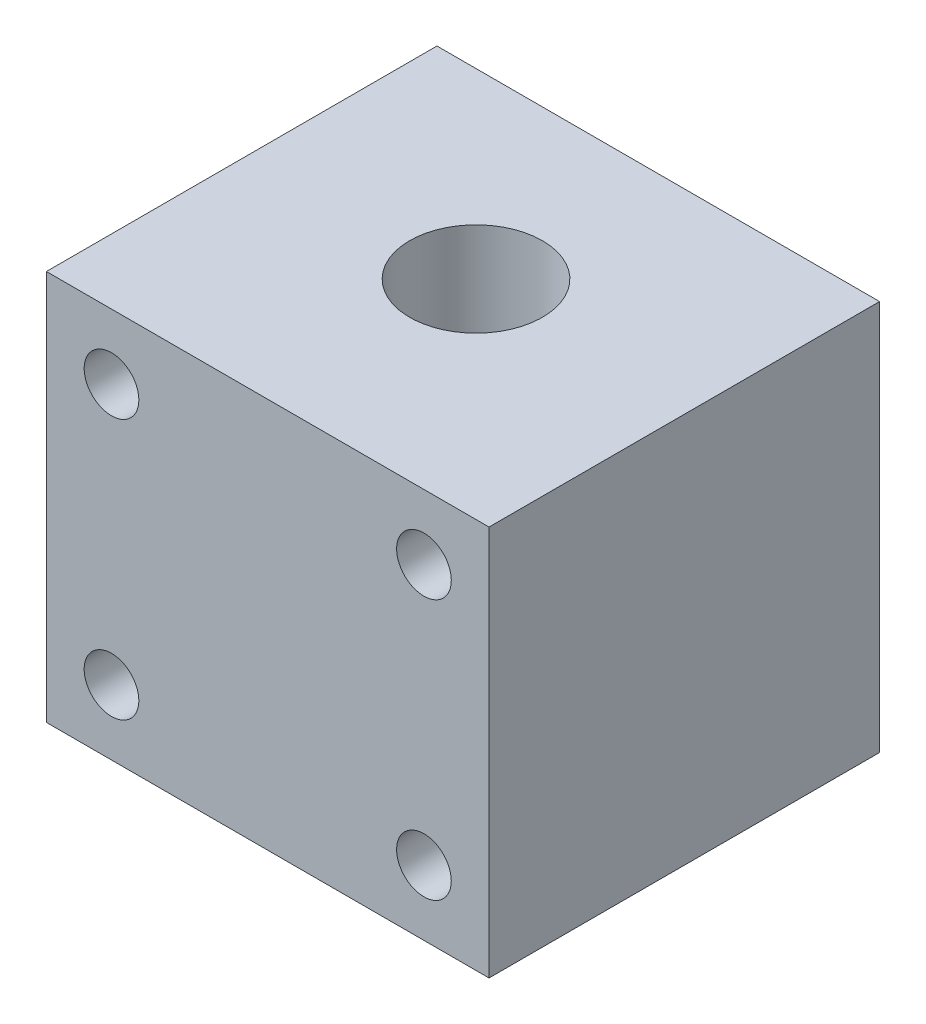
ISO-10303-21;
HEADER;
FILE_DESCRIPTION(('STEP AP214'),'2;1');
FILE_NAME('part.step','',(''),(''),'','','');
FILE_SCHEMA(('AUTOMOTIVE_DESIGN { 1 0 10303 214 1 1 1 1 }'));
ENDSEC;
DATA;
#1=APPLICATION_CONTEXT('core data for automotive mechanical design processes');
#2=APPLICATION_PROTOCOL_DEFINITION('international standard','automotive_design',2000,#1);
#3=PRODUCT_CONTEXT('',#1,'mechanical');
#4=PRODUCT('Part','Part','',(#3));
#5=PRODUCT_RELATED_PRODUCT_CATEGORY('part','',(#4));
#6=PRODUCT_DEFINITION_FORMATION('','',#4);
#7=PRODUCT_DEFINITION_CONTEXT('part definition',#1,'design');
#8=PRODUCT_DEFINITION('design','',#6,#7);
#9=PRODUCT_DEFINITION_SHAPE('','',#8);
#10=(LENGTH_UNIT() NAMED_UNIT(*) SI_UNIT(.MILLI.,.METRE.));
#11=(NAMED_UNIT(*) PLANE_ANGLE_UNIT() SI_UNIT($,.RADIAN.));
#12=(NAMED_UNIT(*) SI_UNIT($,.STERADIAN.) SOLID_ANGLE_UNIT());
#13=UNCERTAINTY_MEASURE_WITH_UNIT(LENGTH_MEASURE(1.E-05),#10,'distance_accuracy_value','');
#14=(GEOMETRIC_REPRESENTATION_CONTEXT(3) GLOBAL_UNCERTAINTY_ASSIGNED_CONTEXT((#13)) GLOBAL_UNIT_ASSIGNED_CONTEXT((#10,
#11,#12)) REPRESENTATION_CONTEXT('',''));
#15=CARTESIAN_POINT('',(0.,0.,0.));
#16=DIRECTION('',(0.,0.,1.));
#17=DIRECTION('',(1.,0.,0.));
#18=AXIS2_PLACEMENT_3D('',#15,#16,#17);
#19=CARTESIAN_POINT('',(17.,30.,-15.));
#20=DIRECTION('',(-1.,0.,0.));
#21=DIRECTION('',(0.,0.,1.));
#22=AXIS2_PLACEMENT_3D('',#19,#20,#21);
#23=PLANE('',#22);
#24=DIRECTION('',(0.,0.,-1.));
#25=VECTOR('',#24,1.);
#26=CARTESIAN_POINT('',(17.,0.,-15.));
#27=LINE('',#26,#25);
#28=CARTESIAN_POINT('',(17.,0.,15.));
#29=VERTEX_POINT('',#28);
#30=CARTESIAN_POINT('',(17.,0.,-15.));
#31=VERTEX_POINT('',#30);
#32=EDGE_CURVE('E106',#29,#31,#27,.T.);
#33=ORIENTED_EDGE('',*,*,#32,.T.);
#34=DIRECTION('',(0.,-1.,0.));
#35=VECTOR('',#34,1.);
#36=CARTESIAN_POINT('',(17.,30.,-15.));
#37=LINE('',#36,#35);
#38=CARTESIAN_POINT('',(17.,30.,-15.));
#39=VERTEX_POINT('',#38);
#40=EDGE_CURVE('E11',#39,#31,#37,.T.);
#41=ORIENTED_EDGE('',*,*,#40,.F.);
#42=DIRECTION('',(0.,0.,-1.));
#43=VECTOR('',#42,1.);
#44=CARTESIAN_POINT('',(17.,30.,-15.));
#45=LINE('',#44,#43);
#46=CARTESIAN_POINT('',(17.,30.,15.));
#47=VERTEX_POINT('',#46);
#48=EDGE_CURVE('E90',#47,#39,#45,.T.);
#49=ORIENTED_EDGE('',*,*,#48,.F.);
#50=DIRECTION('',(0.,-1.,0.));
#51=VECTOR('',#50,1.);
#52=CARTESIAN_POINT('',(17.,30.,15.));
#53=LINE('',#52,#51);
#54=EDGE_CURVE('E102',#47,#29,#53,.T.);
#55=ORIENTED_EDGE('',*,*,#54,.T.);
#56=EDGE_LOOP('',(#33,#41,#49,#55));
#57=FACE_BOUND('',#56,.T.);
#58=ADVANCED_FACE('F38',(#57),#23,.F.);
#59=CARTESIAN_POINT('',(-17.,30.,-15.));
#60=DIRECTION('',(0.,0.,1.));
#61=DIRECTION('',(1.,0.,0.));
#62=AXIS2_PLACEMENT_3D('',#59,#60,#61);
#63=PLANE('',#62);
#64=DIRECTION('',(-1.,0.,0.));
#65=VECTOR('',#64,1.);
#66=CARTESIAN_POINT('',(-17.,0.,-15.));
#67=LINE('',#66,#65);
#68=CARTESIAN_POINT('',(-17.,0.,-15.));
#69=VERTEX_POINT('',#68);
#70=EDGE_CURVE('E95',#31,#69,#67,.T.);
#71=ORIENTED_EDGE('',*,*,#70,.T.);
#72=DIRECTION('',(0.,-1.,0.));
#73=VECTOR('',#72,1.);
#74=CARTESIAN_POINT('',(-17.,30.,-15.));
#75=LINE('',#74,#73);
#76=CARTESIAN_POINT('',(-17.,30.,-15.));
#77=VERTEX_POINT('',#76);
#78=EDGE_CURVE('E47',#77,#69,#75,.T.);
#79=ORIENTED_EDGE('',*,*,#78,.F.);
#80=DIRECTION('',(-1.,0.,0.));
#81=VECTOR('',#80,1.);
#82=CARTESIAN_POINT('',(-17.,30.,-15.));
#83=LINE('',#82,#81);
#84=EDGE_CURVE('E85',#39,#77,#83,.T.);
#85=ORIENTED_EDGE('',*,*,#84,.F.);
#86=ORIENTED_EDGE('',*,*,#40,.T.);
#87=EDGE_LOOP('',(#71,#79,#85,#86));
#88=FACE_BOUND('',#87,.T.);
#89=ADVANCED_FACE('F94',(#88),#63,.F.);
#90=CARTESIAN_POINT('',(-17.,30.,-15.));
#91=DIRECTION('',(1.,0.,0.));
#92=DIRECTION('',(0.,0.,-1.));
#93=AXIS2_PLACEMENT_3D('',#90,#91,#92);
#94=PLANE('',#93);
#95=DIRECTION('',(0.,0.,1.));
#96=VECTOR('',#95,1.);
#97=CARTESIAN_POINT('',(-17.,0.,-15.));
#98=LINE('',#97,#96);
#99=CARTESIAN_POINT('',(-17.,0.,15.));
#100=VERTEX_POINT('',#99);
#101=EDGE_CURVE('E72',#69,#100,#98,.T.);
#102=ORIENTED_EDGE('',*,*,#101,.T.);
#103=DIRECTION('',(0.,-1.,0.));
#104=VECTOR('',#103,1.);
#105=CARTESIAN_POINT('',(-17.,30.,15.));
#106=LINE('',#105,#104);
#107=CARTESIAN_POINT('',(-17.,30.,15.));
#108=VERTEX_POINT('',#107);
#109=EDGE_CURVE('E97',#108,#100,#106,.T.);
#110=ORIENTED_EDGE('',*,*,#109,.F.);
#111=DIRECTION('',(0.,0.,1.));
#112=VECTOR('',#111,1.);
#113=CARTESIAN_POINT('',(-17.,30.,-15.));
#114=LINE('',#113,#112);
#115=EDGE_CURVE('E88',#77,#108,#114,.T.);
#116=ORIENTED_EDGE('',*,*,#115,.F.);
#117=ORIENTED_EDGE('',*,*,#78,.T.);
#118=EDGE_LOOP('',(#102,#110,#116,#117));
#119=FACE_BOUND('',#118,.T.);
#120=ADVANCED_FACE('F98',(#119),#94,.F.);
#121=CARTESIAN_POINT('',(-17.,30.,15.));
#122=DIRECTION('',(0.,0.,-1.));
#123=DIRECTION('',(-1.,0.,0.));
#124=AXIS2_PLACEMENT_3D('',#121,#122,#123);
#125=PLANE('',#124);
#126=CARTESIAN_POINT('',(-12.,25.,15.));
#127=DIRECTION('',(0.,0.,1.));
#128=DIRECTION('',(1.,0.,0.));
#129=AXIS2_PLACEMENT_3D('',#126,#127,#128);
#130=CIRCLE('',#129,2.1);
#131=CARTESIAN_POINT('',(-9.9,25.,15.));
#132=VERTEX_POINT('',#131);
#133=EDGE_CURVE('E175',#132,#132,#130,.T.);
#134=ORIENTED_EDGE('',*,*,#133,.F.);
#135=EDGE_LOOP('',(#134));
#136=FACE_BOUND('',#135,.T.);
#137=CARTESIAN_POINT('',(12.,25.,15.));
#138=DIRECTION('',(0.,0.,1.));
#139=DIRECTION('',(1.,0.,0.));
#140=AXIS2_PLACEMENT_3D('',#137,#138,#139);
#141=CIRCLE('',#140,2.1);
#142=CARTESIAN_POINT('',(14.1,25.,15.));
#143=VERTEX_POINT('',#142);
#144=EDGE_CURVE('E183',#143,#143,#141,.T.);
#145=ORIENTED_EDGE('',*,*,#144,.F.);
#146=EDGE_LOOP('',(#145));
#147=FACE_BOUND('',#146,.T.);
#148=CARTESIAN_POINT('',(12.,5.,15.));
#149=DIRECTION('',(0.,0.,1.));
#150=DIRECTION('',(1.,0.,0.));
#151=AXIS2_PLACEMENT_3D('',#148,#149,#150);
#152=CIRCLE('',#151,2.1);
#153=CARTESIAN_POINT('',(14.1,5.,15.));
#154=VERTEX_POINT('',#153);
#155=EDGE_CURVE('E191',#154,#154,#152,.T.);
#156=ORIENTED_EDGE('',*,*,#155,.F.);
#157=EDGE_LOOP('',(#156));
#158=FACE_BOUND('',#157,.T.);
#159=CARTESIAN_POINT('',(-12.,5.,15.));
#160=DIRECTION('',(0.,0.,1.));
#161=DIRECTION('',(1.,0.,0.));
#162=AXIS2_PLACEMENT_3D('',#159,#160,#161);
#163=CIRCLE('',#162,2.1);
#164=CARTESIAN_POINT('',(-9.9,5.,15.));
#165=VERTEX_POINT('',#164);
#166=EDGE_CURVE('E167',#165,#165,#163,.T.);
#167=ORIENTED_EDGE('',*,*,#166,.F.);
#168=EDGE_LOOP('',(#167));
#169=FACE_BOUND('',#168,.T.);
#170=DIRECTION('',(1.,0.,0.));
#171=VECTOR('',#170,1.);
#172=CARTESIAN_POINT('',(-17.,0.,15.));
#173=LINE('',#172,#171);
#174=EDGE_CURVE('E78',#100,#29,#173,.T.);
#175=ORIENTED_EDGE('',*,*,#174,.T.);
#176=ORIENTED_EDGE('',*,*,#54,.F.);
#177=DIRECTION('',(1.,0.,0.));
#178=VECTOR('',#177,1.);
#179=CARTESIAN_POINT('',(-17.,30.,15.));
#180=LINE('',#179,#178);
#181=EDGE_CURVE('E55',#108,#47,#180,.T.);
#182=ORIENTED_EDGE('',*,*,#181,.F.);
#183=ORIENTED_EDGE('',*,*,#109,.T.);
#184=EDGE_LOOP('',(#175,#176,#182,#183));
#185=FACE_BOUND('',#184,.T.);
#186=ADVANCED_FACE('F120',(#136,#147,#158,#169,#185),#125,.F.);
#187=CARTESIAN_POINT('',(0.,30.,0.));
#188=DIRECTION('',(0.,1.,0.));
#189=DIRECTION('',(0.,0.,1.));
#190=AXIS2_PLACEMENT_3D('',#187,#188,#189);
#191=PLANE('',#190);
#192=CARTESIAN_POINT('',(0.,30.,-1.));
#193=DIRECTION('',(0.,-1.,0.));
#194=DIRECTION('',(0.,0.,-1.));
#195=AXIS2_PLACEMENT_3D('',#192,#193,#194);
#196=CIRCLE('',#195,5.1);
#197=CARTESIAN_POINT('',(0.,30.,-6.1));
#198=VERTEX_POINT('',#197);
#199=EDGE_CURVE('E110',#198,#198,#196,.T.);
#200=ORIENTED_EDGE('',*,*,#199,.T.);
#201=EDGE_LOOP('',(#200));
#202=FACE_BOUND('',#201,.T.);
#203=ORIENTED_EDGE('',*,*,#48,.T.);
#204=ORIENTED_EDGE('',*,*,#84,.T.);
#205=ORIENTED_EDGE('',*,*,#115,.T.);
#206=ORIENTED_EDGE('',*,*,#181,.T.);
#207=EDGE_LOOP('',(#203,#204,#205,#206));
#208=FACE_BOUND('',#207,.T.);
#209=ADVANCED_FACE('F86',(#202,#208),#191,.T.);
#210=CARTESIAN_POINT('',(0.,0.,0.));
#211=DIRECTION('',(0.,1.,0.));
#212=DIRECTION('',(0.,0.,1.));
#213=AXIS2_PLACEMENT_3D('',#210,#211,#212);
#214=PLANE('',#213);
#215=CARTESIAN_POINT('',(-8.,0.,-1.));
#216=DIRECTION('',(0.,-1.,0.));
#217=DIRECTION('',(0.,0.,-1.));
#218=AXIS2_PLACEMENT_3D('',#215,#216,#217);
#219=CIRCLE('',#218,1.55);
#220=CARTESIAN_POINT('',(-8.,0.,-2.55));
#221=VERTEX_POINT('',#220);
#222=EDGE_CURVE('E160',#221,#221,#219,.T.);
#223=ORIENTED_EDGE('',*,*,#222,.F.);
#224=EDGE_LOOP('',(#223));
#225=FACE_BOUND('',#224,.T.);
#226=CARTESIAN_POINT('',(0.,0.,7.));
#227=DIRECTION('',(0.,-1.,0.));
#228=DIRECTION('',(0.,0.,-1.));
#229=AXIS2_PLACEMENT_3D('',#226,#227,#228);
#230=CIRCLE('',#229,1.55);
#231=CARTESIAN_POINT('',(0.,0.,5.45));
#232=VERTEX_POINT('',#231);
#233=EDGE_CURVE('E152',#232,#232,#230,.T.);
#234=ORIENTED_EDGE('',*,*,#233,.F.);
#235=EDGE_LOOP('',(#234));
#236=FACE_BOUND('',#235,.T.);
#237=CARTESIAN_POINT('',(8.,0.,-1.));
#238=DIRECTION('',(0.,-1.,0.));
#239=DIRECTION('',(0.,0.,-1.));
#240=AXIS2_PLACEMENT_3D('',#237,#238,#239);
#241=CIRCLE('',#240,1.55);
#242=CARTESIAN_POINT('',(8.,0.,-2.55));
#243=VERTEX_POINT('',#242);
#244=EDGE_CURVE('E144',#243,#243,#241,.T.);
#245=ORIENTED_EDGE('',*,*,#244,.F.);
#246=EDGE_LOOP('',(#245));
#247=FACE_BOUND('',#246,.T.);
#248=CARTESIAN_POINT('',(0.,0.,-9.));
#249=DIRECTION('',(0.,-1.,0.));
#250=DIRECTION('',(0.,0.,-1.));
#251=AXIS2_PLACEMENT_3D('',#248,#249,#250);
#252=CIRCLE('',#251,1.55);
#253=CARTESIAN_POINT('',(0.,0.,-10.55));
#254=VERTEX_POINT('',#253);
#255=EDGE_CURVE('E135',#254,#254,#252,.T.);
#256=ORIENTED_EDGE('',*,*,#255,.F.);
#257=EDGE_LOOP('',(#256));
#258=FACE_BOUND('',#257,.T.);
#259=CARTESIAN_POINT('',(0.,0.,-1.));
#260=DIRECTION('',(0.,-1.,0.));
#261=DIRECTION('',(0.,0.,-1.));
#262=AXIS2_PLACEMENT_3D('',#259,#260,#261);
#263=CIRCLE('',#262,5.1);
#264=CARTESIAN_POINT('',(0.,0.,-6.1));
#265=VERTEX_POINT('',#264);
#266=EDGE_CURVE('E127',#265,#265,#263,.T.);
#267=ORIENTED_EDGE('',*,*,#266,.F.);
#268=EDGE_LOOP('',(#267));
#269=FACE_BOUND('',#268,.T.);
#270=ORIENTED_EDGE('',*,*,#32,.F.);
#271=ORIENTED_EDGE('',*,*,#174,.F.);
#272=ORIENTED_EDGE('',*,*,#101,.F.);
#273=ORIENTED_EDGE('',*,*,#70,.F.);
#274=EDGE_LOOP('',(#270,#271,#272,#273));
#275=FACE_BOUND('',#274,.T.);
#276=ADVANCED_FACE('F123',(#225,#236,#247,#258,#269,#275),#214,.F.);
#277=CARTESIAN_POINT('',(0.,30.,-1.));
#278=DIRECTION('',(0.,-1.,0.));
#279=DIRECTION('',(0.,0.,-1.));
#280=AXIS2_PLACEMENT_3D('',#277,#278,#279);
#281=CYLINDRICAL_SURFACE('',#280,5.1);
#282=ORIENTED_EDGE('',*,*,#199,.F.);
#283=EDGE_LOOP('',(#282));
#284=FACE_BOUND('',#283,.T.);
#285=ORIENTED_EDGE('',*,*,#266,.T.);
#286=EDGE_LOOP('',(#285));
#287=FACE_BOUND('',#286,.T.);
#288=ADVANCED_FACE('F240',(#284,#287),#281,.F.);
#289=CARTESIAN_POINT('',(0.,15.,-9.));
#290=DIRECTION('',(0.,-1.,0.));
#291=DIRECTION('',(0.,0.,-1.));
#292=AXIS2_PLACEMENT_3D('',#289,#290,#291);
#293=CYLINDRICAL_SURFACE('',#292,1.55);
#294=CARTESIAN_POINT('',(0.,15.,-9.));
#295=DIRECTION('',(0.,-1.,0.));
#296=DIRECTION('',(0.,0.,-1.));
#297=AXIS2_PLACEMENT_3D('',#294,#295,#296);
#298=CIRCLE('',#297,1.55);
#299=CARTESIAN_POINT('',(0.,15.,-10.55));
#300=VERTEX_POINT('',#299);
#301=EDGE_CURVE('E139',#300,#300,#298,.T.);
#302=ORIENTED_EDGE('',*,*,#301,.F.);
#303=EDGE_LOOP('',(#302));
#304=FACE_BOUND('',#303,.T.);
#305=ORIENTED_EDGE('',*,*,#255,.T.);
#306=EDGE_LOOP('',(#305));
#307=FACE_BOUND('',#306,.T.);
#308=ADVANCED_FACE('F247',(#304,#307),#293,.F.);
#309=CARTESIAN_POINT('',(0.,15.,-9.));
#310=DIRECTION('',(0.,-1.,0.));
#311=DIRECTION('',(0.,0.,-1.));
#312=AXIS2_PLACEMENT_3D('',#309,#310,#311);
#313=PLANE('',#312);
#314=ORIENTED_EDGE('',*,*,#301,.T.);
#315=EDGE_LOOP('',(#314));
#316=FACE_BOUND('',#315,.T.);
#317=ADVANCED_FACE('F251',(#316),#313,.T.);
#318=CARTESIAN_POINT('',(8.,15.,-1.));
#319=DIRECTION('',(0.,-1.,0.));
#320=DIRECTION('',(0.,0.,-1.));
#321=AXIS2_PLACEMENT_3D('',#318,#319,#320);
#322=CYLINDRICAL_SURFACE('',#321,1.55);
#323=CARTESIAN_POINT('',(8.,15.,-1.));
#324=DIRECTION('',(0.,-1.,0.));
#325=DIRECTION('',(0.,0.,-1.));
#326=AXIS2_PLACEMENT_3D('',#323,#324,#325);
#327=CIRCLE('',#326,1.55);
#328=CARTESIAN_POINT('',(8.,15.,-2.55));
#329=VERTEX_POINT('',#328);
#330=EDGE_CURVE('E148',#329,#329,#327,.T.);
#331=ORIENTED_EDGE('',*,*,#330,.F.);
#332=EDGE_LOOP('',(#331));
#333=FACE_BOUND('',#332,.T.);
#334=ORIENTED_EDGE('',*,*,#244,.T.);
#335=EDGE_LOOP('',(#334));
#336=FACE_BOUND('',#335,.T.);
#337=ADVANCED_FACE('F255',(#333,#336),#322,.F.);
#338=CARTESIAN_POINT('',(8.,15.,-1.));
#339=DIRECTION('',(0.,-1.,0.));
#340=DIRECTION('',(0.,0.,-1.));
#341=AXIS2_PLACEMENT_3D('',#338,#339,#340);
#342=PLANE('',#341);
#343=ORIENTED_EDGE('',*,*,#330,.T.);
#344=EDGE_LOOP('',(#343));
#345=FACE_BOUND('',#344,.T.);
#346=ADVANCED_FACE('F259',(#345),#342,.T.);
#347=CARTESIAN_POINT('',(0.,15.,7.));
#348=DIRECTION('',(0.,-1.,0.));
#349=DIRECTION('',(0.,0.,-1.));
#350=AXIS2_PLACEMENT_3D('',#347,#348,#349);
#351=CYLINDRICAL_SURFACE('',#350,1.55);
#352=CARTESIAN_POINT('',(0.,15.,7.));
#353=DIRECTION('',(0.,-1.,0.));
#354=DIRECTION('',(0.,0.,-1.));
#355=AXIS2_PLACEMENT_3D('',#352,#353,#354);
#356=CIRCLE('',#355,1.55);
#357=CARTESIAN_POINT('',(0.,15.,5.45));
#358=VERTEX_POINT('',#357);
#359=EDGE_CURVE('E156',#358,#358,#356,.T.);
#360=ORIENTED_EDGE('',*,*,#359,.F.);
#361=EDGE_LOOP('',(#360));
#362=FACE_BOUND('',#361,.T.);
#363=ORIENTED_EDGE('',*,*,#233,.T.);
#364=EDGE_LOOP('',(#363));
#365=FACE_BOUND('',#364,.T.);
#366=ADVANCED_FACE('F263',(#362,#365),#351,.F.);
#367=CARTESIAN_POINT('',(0.,15.,7.));
#368=DIRECTION('',(0.,-1.,0.));
#369=DIRECTION('',(0.,0.,-1.));
#370=AXIS2_PLACEMENT_3D('',#367,#368,#369);
#371=PLANE('',#370);
#372=ORIENTED_EDGE('',*,*,#359,.T.);
#373=EDGE_LOOP('',(#372));
#374=FACE_BOUND('',#373,.T.);
#375=ADVANCED_FACE('F267',(#374),#371,.T.);
#376=CARTESIAN_POINT('',(-8.,15.,-1.));
#377=DIRECTION('',(0.,-1.,0.));
#378=DIRECTION('',(0.,0.,-1.));
#379=AXIS2_PLACEMENT_3D('',#376,#377,#378);
#380=CYLINDRICAL_SURFACE('',#379,1.55);
#381=CARTESIAN_POINT('',(-8.,15.,-1.));
#382=DIRECTION('',(0.,-1.,0.));
#383=DIRECTION('',(0.,0.,-1.));
#384=AXIS2_PLACEMENT_3D('',#381,#382,#383);
#385=CIRCLE('',#384,1.55);
#386=CARTESIAN_POINT('',(-8.,15.,-2.55));
#387=VERTEX_POINT('',#386);
#388=EDGE_CURVE('E131',#387,#387,#385,.T.);
#389=ORIENTED_EDGE('',*,*,#388,.F.);
#390=EDGE_LOOP('',(#389));
#391=FACE_BOUND('',#390,.T.);
#392=ORIENTED_EDGE('',*,*,#222,.T.);
#393=EDGE_LOOP('',(#392));
#394=FACE_BOUND('',#393,.T.);
#395=ADVANCED_FACE('F225',(#391,#394),#380,.F.);
#396=CARTESIAN_POINT('',(-8.,15.,-1.));
#397=DIRECTION('',(0.,-1.,0.));
#398=DIRECTION('',(0.,0.,-1.));
#399=AXIS2_PLACEMENT_3D('',#396,#397,#398);
#400=PLANE('',#399);
#401=ORIENTED_EDGE('',*,*,#388,.T.);
#402=EDGE_LOOP('',(#401));
#403=FACE_BOUND('',#402,.T.);
#404=ADVANCED_FACE('F216',(#403),#400,.T.);
#405=CARTESIAN_POINT('',(-12.,5.,-5.));
#406=DIRECTION('',(0.,0.,1.));
#407=DIRECTION('',(1.,0.,0.));
#408=AXIS2_PLACEMENT_3D('',#405,#406,#407);
#409=CYLINDRICAL_SURFACE('',#408,2.1);
#410=CARTESIAN_POINT('',(-12.,5.,-5.));
#411=DIRECTION('',(0.,0.,1.));
#412=DIRECTION('',(1.,0.,0.));
#413=AXIS2_PLACEMENT_3D('',#410,#411,#412);
#414=CIRCLE('',#413,2.1);
#415=CARTESIAN_POINT('',(-9.9,5.,-5.));
#416=VERTEX_POINT('',#415);
#417=EDGE_CURVE('E140',#416,#416,#414,.T.);
#418=ORIENTED_EDGE('',*,*,#417,.F.);
#419=EDGE_LOOP('',(#418));
#420=FACE_BOUND('',#419,.T.);
#421=ORIENTED_EDGE('',*,*,#166,.T.);
#422=EDGE_LOOP('',(#421));
#423=FACE_BOUND('',#422,.T.);
#424=ADVANCED_FACE('F214',(#420,#423),#409,.F.);
#425=CARTESIAN_POINT('',(-12.,5.,-5.));
#426=DIRECTION('',(0.,0.,1.));
#427=DIRECTION('',(1.,0.,0.));
#428=AXIS2_PLACEMENT_3D('',#425,#426,#427);
#429=PLANE('',#428);
#430=ORIENTED_EDGE('',*,*,#417,.T.);
#431=EDGE_LOOP('',(#430));
#432=FACE_BOUND('',#431,.T.);
#433=ADVANCED_FACE('F204',(#432),#429,.T.);
#434=CARTESIAN_POINT('',(12.,5.,-5.));
#435=DIRECTION('',(0.,0.,1.));
#436=DIRECTION('',(1.,0.,0.));
#437=AXIS2_PLACEMENT_3D('',#434,#435,#436);
#438=CYLINDRICAL_SURFACE('',#437,2.1);
#439=CARTESIAN_POINT('',(12.,5.,-5.));
#440=DIRECTION('',(0.,0.,1.));
#441=DIRECTION('',(1.,0.,0.));
#442=AXIS2_PLACEMENT_3D('',#439,#440,#441);
#443=CIRCLE('',#442,2.1);
#444=CARTESIAN_POINT('',(14.1,5.,-5.));
#445=VERTEX_POINT('',#444);
#446=EDGE_CURVE('E171',#445,#445,#443,.T.);
#447=ORIENTED_EDGE('',*,*,#446,.F.);
#448=EDGE_LOOP('',(#447));
#449=FACE_BOUND('',#448,.T.);
#450=ORIENTED_EDGE('',*,*,#155,.T.);
#451=EDGE_LOOP('',(#450));
#452=FACE_BOUND('',#451,.T.);
#453=ADVANCED_FACE('F201',(#449,#452),#438,.F.);
#454=CARTESIAN_POINT('',(12.,5.,-5.));
#455=DIRECTION('',(0.,0.,1.));
#456=DIRECTION('',(1.,0.,0.));
#457=AXIS2_PLACEMENT_3D('',#454,#455,#456);
#458=PLANE('',#457);
#459=ORIENTED_EDGE('',*,*,#446,.T.);
#460=EDGE_LOOP('',(#459));
#461=FACE_BOUND('',#460,.T.);
#462=ADVANCED_FACE('F199',(#461),#458,.T.);
#463=CARTESIAN_POINT('',(12.,25.,-5.));
#464=DIRECTION('',(0.,0.,1.));
#465=DIRECTION('',(1.,0.,0.));
#466=AXIS2_PLACEMENT_3D('',#463,#464,#465);
#467=CYLINDRICAL_SURFACE('',#466,2.1);
#468=CARTESIAN_POINT('',(12.,25.,-5.));
#469=DIRECTION('',(0.,0.,1.));
#470=DIRECTION('',(1.,0.,0.));
#471=AXIS2_PLACEMENT_3D('',#468,#469,#470);
#472=CIRCLE('',#471,2.1);
#473=CARTESIAN_POINT('',(14.1,25.,-5.));
#474=VERTEX_POINT('',#473);
#475=EDGE_CURVE('E187',#474,#474,#472,.T.);
#476=ORIENTED_EDGE('',*,*,#475,.F.);
#477=EDGE_LOOP('',(#476));
#478=FACE_BOUND('',#477,.T.);
#479=ORIENTED_EDGE('',*,*,#144,.T.);
#480=EDGE_LOOP('',(#479));
#481=FACE_BOUND('',#480,.T.);
#482=ADVANCED_FACE('F330',(#478,#481),#467,.F.);
#483=CARTESIAN_POINT('',(12.,25.,-5.));
#484=DIRECTION('',(0.,0.,1.));
#485=DIRECTION('',(1.,0.,0.));
#486=AXIS2_PLACEMENT_3D('',#483,#484,#485);
#487=PLANE('',#486);
#488=ORIENTED_EDGE('',*,*,#475,.T.);
#489=EDGE_LOOP('',(#488));
#490=FACE_BOUND('',#489,.T.);
#491=ADVANCED_FACE('F339',(#490),#487,.T.);
#492=CARTESIAN_POINT('',(-12.,25.,-5.));
#493=DIRECTION('',(0.,0.,1.));
#494=DIRECTION('',(1.,0.,0.));
#495=AXIS2_PLACEMENT_3D('',#492,#493,#494);
#496=CYLINDRICAL_SURFACE('',#495,2.1);
#497=CARTESIAN_POINT('',(-12.,25.,-5.));
#498=DIRECTION('',(0.,0.,1.));
#499=DIRECTION('',(1.,0.,0.));
#500=AXIS2_PLACEMENT_3D('',#497,#498,#499);
#501=CIRCLE('',#500,2.1);
#502=CARTESIAN_POINT('',(-9.9,25.,-5.));
#503=VERTEX_POINT('',#502);
#504=EDGE_CURVE('E179',#503,#503,#501,.T.);
#505=ORIENTED_EDGE('',*,*,#504,.F.);
#506=EDGE_LOOP('',(#505));
#507=FACE_BOUND('',#506,.T.);
#508=ORIENTED_EDGE('',*,*,#133,.T.);
#509=EDGE_LOOP('',(#508));
#510=FACE_BOUND('',#509,.T.);
#511=ADVANCED_FACE('F349',(#507,#510),#496,.F.);
#512=CARTESIAN_POINT('',(-12.,25.,-5.));
#513=DIRECTION('',(0.,0.,1.));
#514=DIRECTION('',(1.,0.,0.));
#515=AXIS2_PLACEMENT_3D('',#512,#513,#514);
#516=PLANE('',#515);
#517=ORIENTED_EDGE('',*,*,#504,.T.);
#518=EDGE_LOOP('',(#517));
#519=FACE_BOUND('',#518,.T.);
#520=ADVANCED_FACE('F359',(#519),#516,.T.);
#521=CLOSED_SHELL('',(#58,#89,#120,#186,#209,#276,#288,#308,#317,#337,#346,#366,#375,#395,#404,
#424,#433,#453,#462,#482,#491,#511,#520));
#522=MANIFOLD_SOLID_BREP('B2',#521);
#523=ADVANCED_BREP_SHAPE_REPRESENTATION('',(#18,#522),#14);
#524=SHAPE_DEFINITION_REPRESENTATION(#9,#523);
ENDSEC;
END-ISO-10303-21;
